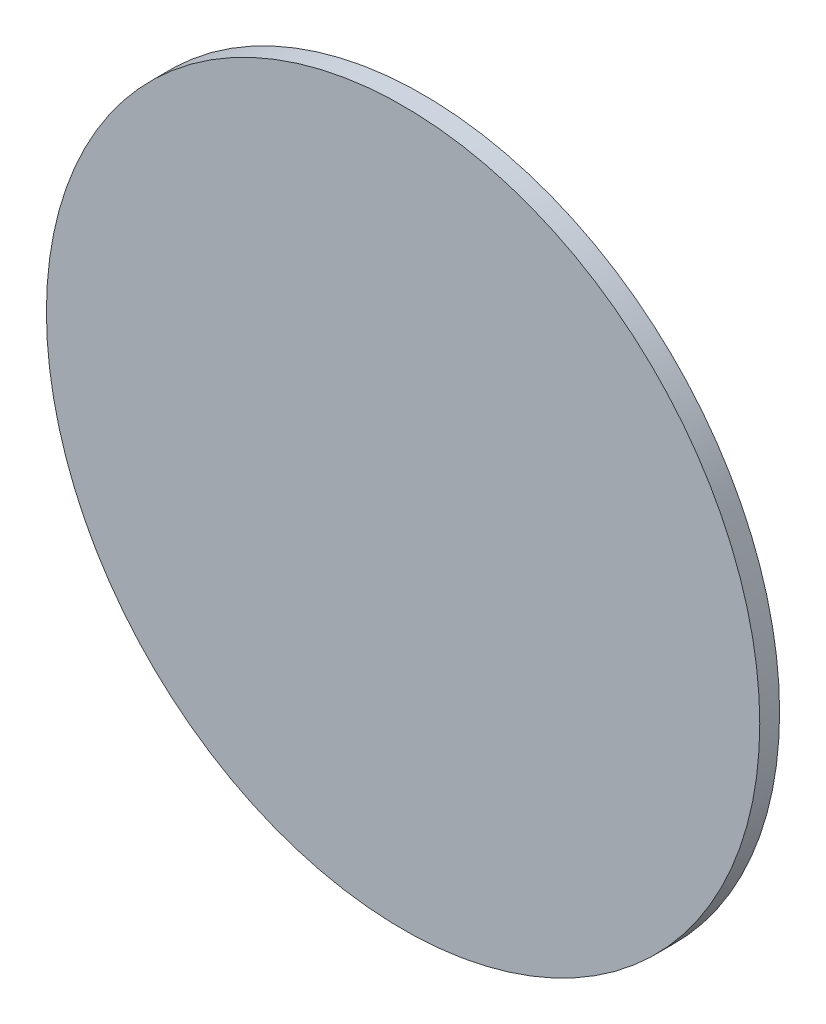
ISO-10303-21;
HEADER;
FILE_DESCRIPTION(('STEP AP214'),'2;1');
FILE_NAME('part.step','',(''),(''),'','','');
FILE_SCHEMA(('AUTOMOTIVE_DESIGN { 1 0 10303 214 1 1 1 1 }'));
ENDSEC;
DATA;
#1=APPLICATION_CONTEXT('core data for automotive mechanical design processes');
#2=APPLICATION_PROTOCOL_DEFINITION('international standard','automotive_design',2000,#1);
#3=PRODUCT_CONTEXT('',#1,'mechanical');
#4=PRODUCT('Part','Part','',(#3));
#5=PRODUCT_RELATED_PRODUCT_CATEGORY('part','',(#4));
#6=PRODUCT_DEFINITION_FORMATION('','',#4);
#7=PRODUCT_DEFINITION_CONTEXT('part definition',#1,'design');
#8=PRODUCT_DEFINITION('design','',#6,#7);
#9=PRODUCT_DEFINITION_SHAPE('','',#8);
#10=(LENGTH_UNIT() NAMED_UNIT(*) SI_UNIT(.MILLI.,.METRE.));
#11=(NAMED_UNIT(*) PLANE_ANGLE_UNIT() SI_UNIT($,.RADIAN.));
#12=(NAMED_UNIT(*) SI_UNIT($,.STERADIAN.) SOLID_ANGLE_UNIT());
#13=UNCERTAINTY_MEASURE_WITH_UNIT(LENGTH_MEASURE(1.E-05),#10,'distance_accuracy_value','');
#14=(GEOMETRIC_REPRESENTATION_CONTEXT(3) GLOBAL_UNCERTAINTY_ASSIGNED_CONTEXT((#13)) GLOBAL_UNIT_ASSIGNED_CONTEXT((#10,
#11,#12)) REPRESENTATION_CONTEXT('',''));
#15=CARTESIAN_POINT('',(0.,0.,0.));
#16=DIRECTION('',(0.,0.,1.));
#17=DIRECTION('',(1.,0.,0.));
#18=AXIS2_PLACEMENT_3D('',#15,#16,#17);
#19=CARTESIAN_POINT('',(0.,0.,5.));
#20=DIRECTION('',(0.,0.,-1.));
#21=DIRECTION('',(-1.,0.,0.));
#22=AXIS2_PLACEMENT_3D('',#19,#20,#21);
#23=CYLINDRICAL_SURFACE('',#22,90.);
#24=CARTESIAN_POINT('',(0.,0.,5.));
#25=DIRECTION('',(0.,0.,1.));
#26=DIRECTION('',(1.,0.,0.));
#27=AXIS2_PLACEMENT_3D('',#24,#25,#26);
#28=CIRCLE('',#27,90.);
#29=CARTESIAN_POINT('',(90.,0.,5.));
#30=VERTEX_POINT('',#29);
#31=EDGE_CURVE('E10',#30,#30,#28,.T.);
#32=ORIENTED_EDGE('',*,*,#31,.F.);
#33=EDGE_LOOP('',(#32));
#34=FACE_BOUND('',#33,.T.);
#35=CARTESIAN_POINT('',(0.,0.,0.));
#36=DIRECTION('',(0.,0.,1.));
#37=DIRECTION('',(1.,0.,0.));
#38=AXIS2_PLACEMENT_3D('',#35,#36,#37);
#39=CIRCLE('',#38,90.);
#40=CARTESIAN_POINT('',(90.,0.,0.));
#41=VERTEX_POINT('',#40);
#42=EDGE_CURVE('E35',#41,#41,#39,.T.);
#43=ORIENTED_EDGE('',*,*,#42,.T.);
#44=EDGE_LOOP('',(#43));
#45=FACE_BOUND('',#44,.T.);
#46=ADVANCED_FACE('F32',(#34,#45),#23,.T.);
#47=CARTESIAN_POINT('',(0.,0.,5.));
#48=DIRECTION('',(0.,0.,1.));
#49=DIRECTION('',(1.,0.,0.));
#50=AXIS2_PLACEMENT_3D('',#47,#48,#49);
#51=PLANE('',#50);
#52=ORIENTED_EDGE('',*,*,#31,.T.);
#53=EDGE_LOOP('',(#52));
#54=FACE_BOUND('',#53,.T.);
#55=ADVANCED_FACE('F47',(#54),#51,.T.);
#56=CARTESIAN_POINT('',(0.,0.,0.));
#57=DIRECTION('',(0.,0.,1.));
#58=DIRECTION('',(1.,0.,0.));
#59=AXIS2_PLACEMENT_3D('',#56,#57,#58);
#60=PLANE('',#59);
#61=ORIENTED_EDGE('',*,*,#42,.F.);
#62=EDGE_LOOP('',(#61));
#63=FACE_BOUND('',#62,.T.);
#64=ADVANCED_FACE('F45',(#63),#60,.F.);
#65=CLOSED_SHELL('',(#46,#55,#64));
#66=MANIFOLD_SOLID_BREP('B2',#65);
#67=ADVANCED_BREP_SHAPE_REPRESENTATION('',(#18,#66),#14);
#68=SHAPE_DEFINITION_REPRESENTATION(#9,#67);
ENDSEC;
END-ISO-10303-21;
